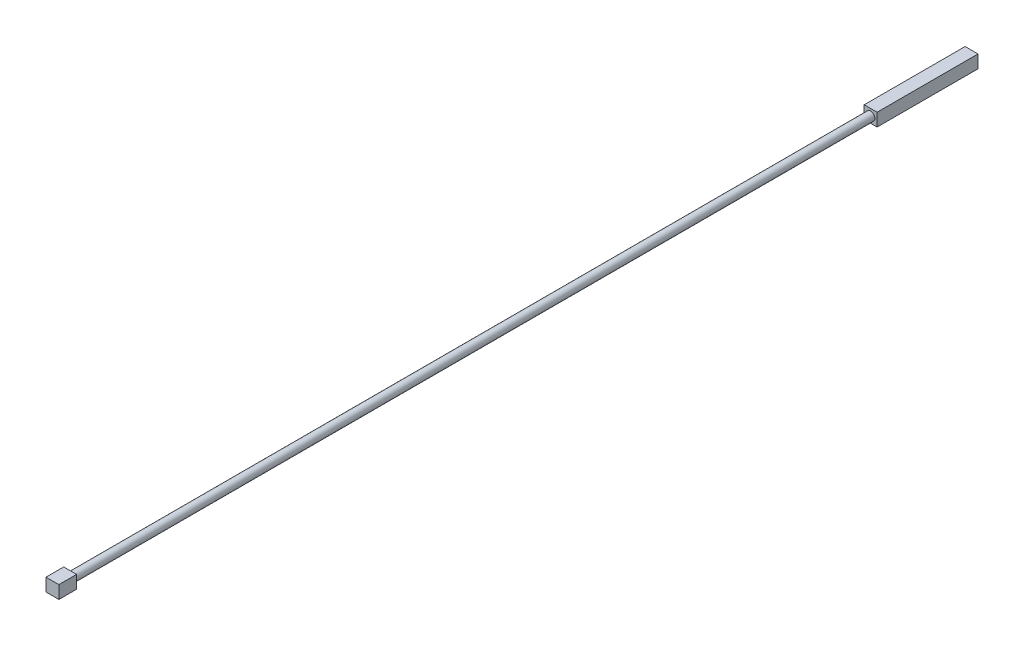
ISO-10303-21;
HEADER;
FILE_DESCRIPTION(('STEP AP214'),'2;1');
FILE_NAME('part.step','',(''),(''),'','','');
FILE_SCHEMA(('AUTOMOTIVE_DESIGN { 1 0 10303 214 1 1 1 1 }'));
ENDSEC;
DATA;
#1=APPLICATION_CONTEXT('core data for automotive mechanical design processes');
#2=APPLICATION_PROTOCOL_DEFINITION('international standard','automotive_design',2000,#1);
#3=PRODUCT_CONTEXT('',#1,'mechanical');
#4=PRODUCT('Part','Part','',(#3));
#5=PRODUCT_RELATED_PRODUCT_CATEGORY('part','',(#4));
#6=PRODUCT_DEFINITION_FORMATION('','',#4);
#7=PRODUCT_DEFINITION_CONTEXT('part definition',#1,'design');
#8=PRODUCT_DEFINITION('design','',#6,#7);
#9=PRODUCT_DEFINITION_SHAPE('','',#8);
#10=(LENGTH_UNIT() NAMED_UNIT(*) SI_UNIT(.MILLI.,.METRE.));
#11=(NAMED_UNIT(*) PLANE_ANGLE_UNIT() SI_UNIT($,.RADIAN.));
#12=(NAMED_UNIT(*) SI_UNIT($,.STERADIAN.) SOLID_ANGLE_UNIT());
#13=UNCERTAINTY_MEASURE_WITH_UNIT(LENGTH_MEASURE(1.E-05),#10,'distance_accuracy_value','');
#14=(GEOMETRIC_REPRESENTATION_CONTEXT(3) GLOBAL_UNCERTAINTY_ASSIGNED_CONTEXT((#13)) GLOBAL_UNIT_ASSIGNED_CONTEXT((#10,
#11,#12)) REPRESENTATION_CONTEXT('',''));
#15=CARTESIAN_POINT('',(0.,0.,0.));
#16=DIRECTION('',(0.,0.,1.));
#17=DIRECTION('',(1.,0.,0.));
#18=AXIS2_PLACEMENT_3D('',#15,#16,#17);
#19=CARTESIAN_POINT('',(0.,0.,1069.975));
#20=DIRECTION('',(0.,0.,-1.));
#21=DIRECTION('',(-1.,0.,0.));
#22=AXIS2_PLACEMENT_3D('',#19,#20,#21);
#23=CYLINDRICAL_SURFACE('',#22,5.);
#24=CARTESIAN_POINT('',(0.,0.,117.475));
#25=DIRECTION('',(0.,0.,-1.));
#26=DIRECTION('',(-1.,0.,0.));
#27=AXIS2_PLACEMENT_3D('',#24,#25,#26);
#28=CIRCLE('',#27,5.);
#29=CARTESIAN_POINT('',(-5.,0.,117.475));
#30=VERTEX_POINT('',#29);
#31=EDGE_CURVE('E48',#30,#30,#28,.T.);
#32=ORIENTED_EDGE('',*,*,#31,.F.);
#33=EDGE_LOOP('',(#32));
#34=FACE_BOUND('',#33,.T.);
#35=CARTESIAN_POINT('',(0.,0.,1049.3375));
#36=DIRECTION('',(0.,0.,1.));
#37=DIRECTION('',(1.,0.,0.));
#38=AXIS2_PLACEMENT_3D('',#35,#36,#37);
#39=CIRCLE('',#38,5.);
#40=CARTESIAN_POINT('',(5.,0.,1049.3375));
#41=VERTEX_POINT('',#40);
#42=EDGE_CURVE('E11',#41,#41,#39,.T.);
#43=ORIENTED_EDGE('',*,*,#42,.F.);
#44=EDGE_LOOP('',(#43));
#45=FACE_BOUND('',#44,.T.);
#46=ADVANCED_FACE('F39',(#34,#45),#23,.T.);
#47=CARTESIAN_POINT('',(-7.5,7.5,117.475));
#48=DIRECTION('',(1.,0.,0.));
#49=DIRECTION('',(0.,1.,0.));
#50=AXIS2_PLACEMENT_3D('',#47,#48,#49);
#51=PLANE('',#50);
#52=DIRECTION('',(0.,-1.,0.));
#53=VECTOR('',#52,1.);
#54=CARTESIAN_POINT('',(-7.5,7.5,0.));
#55=LINE('',#54,#53);
#56=CARTESIAN_POINT('',(-7.5,7.5,0.));
#57=VERTEX_POINT('',#56);
#58=CARTESIAN_POINT('',(-7.5,-7.5,0.));
#59=VERTEX_POINT('',#58);
#60=EDGE_CURVE('E164',#57,#59,#55,.T.);
#61=ORIENTED_EDGE('',*,*,#60,.T.);
#62=DIRECTION('',(0.,0.,-1.));
#63=VECTOR('',#62,1.);
#64=CARTESIAN_POINT('',(-7.5,-7.5,117.475));
#65=LINE('',#64,#63);
#66=CARTESIAN_POINT('',(-7.5,-7.5,117.475));
#67=VERTEX_POINT('',#66);
#68=EDGE_CURVE('E199',#67,#59,#65,.T.);
#69=ORIENTED_EDGE('',*,*,#68,.F.);
#70=DIRECTION('',(0.,-1.,0.));
#71=VECTOR('',#70,1.);
#72=CARTESIAN_POINT('',(-7.5,7.5,117.475));
#73=LINE('',#72,#71);
#74=CARTESIAN_POINT('',(-7.5,7.5,117.475));
#75=VERTEX_POINT('',#74);
#76=EDGE_CURVE('E170',#75,#67,#73,.T.);
#77=ORIENTED_EDGE('',*,*,#76,.F.);
#78=DIRECTION('',(0.,0.,-1.));
#79=VECTOR('',#78,1.);
#80=CARTESIAN_POINT('',(-7.5,7.5,117.475));
#81=LINE('',#80,#79);
#82=EDGE_CURVE('E180',#75,#57,#81,.T.);
#83=ORIENTED_EDGE('',*,*,#82,.T.);
#84=EDGE_LOOP('',(#61,#69,#77,#83));
#85=FACE_BOUND('',#84,.T.);
#86=ADVANCED_FACE('F209',(#85),#51,.F.);
#87=CARTESIAN_POINT('',(7.5,-7.5,117.475));
#88=DIRECTION('',(0.,1.,0.));
#89=DIRECTION('',(-1.,0.,0.));
#90=AXIS2_PLACEMENT_3D('',#87,#88,#89);
#91=PLANE('',#90);
#92=DIRECTION('',(1.,0.,0.));
#93=VECTOR('',#92,1.);
#94=CARTESIAN_POINT('',(7.5,-7.5,0.));
#95=LINE('',#94,#93);
#96=CARTESIAN_POINT('',(7.5,-7.5,0.));
#97=VERTEX_POINT('',#96);
#98=EDGE_CURVE('E184',#59,#97,#95,.T.);
#99=ORIENTED_EDGE('',*,*,#98,.T.);
#100=DIRECTION('',(0.,0.,-1.));
#101=VECTOR('',#100,1.);
#102=CARTESIAN_POINT('',(7.5,-7.5,117.475));
#103=LINE('',#102,#101);
#104=CARTESIAN_POINT('',(7.5,-7.5,117.475));
#105=VERTEX_POINT('',#104);
#106=EDGE_CURVE('E196',#105,#97,#103,.T.);
#107=ORIENTED_EDGE('',*,*,#106,.F.);
#108=DIRECTION('',(1.,0.,0.));
#109=VECTOR('',#108,1.);
#110=CARTESIAN_POINT('',(7.5,-7.5,117.475));
#111=LINE('',#110,#109);
#112=EDGE_CURVE('E88',#67,#105,#111,.T.);
#113=ORIENTED_EDGE('',*,*,#112,.F.);
#114=ORIENTED_EDGE('',*,*,#68,.T.);
#115=EDGE_LOOP('',(#99,#107,#113,#114));
#116=FACE_BOUND('',#115,.T.);
#117=ADVANCED_FACE('F242',(#116),#91,.F.);
#118=CARTESIAN_POINT('',(7.5,7.5,117.475));
#119=DIRECTION('',(-1.,0.,0.));
#120=DIRECTION('',(0.,-1.,0.));
#121=AXIS2_PLACEMENT_3D('',#118,#119,#120);
#122=PLANE('',#121);
#123=DIRECTION('',(0.,1.,0.));
#124=VECTOR('',#123,1.);
#125=CARTESIAN_POINT('',(7.5,7.5,0.));
#126=LINE('',#125,#124);
#127=CARTESIAN_POINT('',(7.5,7.5,0.));
#128=VERTEX_POINT('',#127);
#129=EDGE_CURVE('E74',#97,#128,#126,.T.);
#130=ORIENTED_EDGE('',*,*,#129,.T.);
#131=DIRECTION('',(0.,0.,-1.));
#132=VECTOR('',#131,1.);
#133=CARTESIAN_POINT('',(7.5,7.5,117.475));
#134=LINE('',#133,#132);
#135=CARTESIAN_POINT('',(7.5,7.5,117.475));
#136=VERTEX_POINT('',#135);
#137=EDGE_CURVE('E193',#136,#128,#134,.T.);
#138=ORIENTED_EDGE('',*,*,#137,.F.);
#139=DIRECTION('',(0.,1.,0.));
#140=VECTOR('',#139,1.);
#141=CARTESIAN_POINT('',(7.5,7.5,117.475));
#142=LINE('',#141,#140);
#143=EDGE_CURVE('E175',#105,#136,#142,.T.);
#144=ORIENTED_EDGE('',*,*,#143,.F.);
#145=ORIENTED_EDGE('',*,*,#106,.T.);
#146=EDGE_LOOP('',(#130,#138,#144,#145));
#147=FACE_BOUND('',#146,.T.);
#148=ADVANCED_FACE('F239',(#147),#122,.F.);
#149=CARTESIAN_POINT('',(7.5,7.5,117.475));
#150=DIRECTION('',(0.,-1.,0.));
#151=DIRECTION('',(1.,0.,0.));
#152=AXIS2_PLACEMENT_3D('',#149,#150,#151);
#153=PLANE('',#152);
#154=DIRECTION('',(-1.,0.,0.));
#155=VECTOR('',#154,1.);
#156=CARTESIAN_POINT('',(7.5,7.5,0.));
#157=LINE('',#156,#155);
#158=EDGE_CURVE('E80',#128,#57,#157,.T.);
#159=ORIENTED_EDGE('',*,*,#158,.T.);
#160=ORIENTED_EDGE('',*,*,#82,.F.);
#161=DIRECTION('',(-1.,0.,0.));
#162=VECTOR('',#161,1.);
#163=CARTESIAN_POINT('',(7.5,7.5,117.475));
#164=LINE('',#163,#162);
#165=EDGE_CURVE('E56',#136,#75,#164,.T.);
#166=ORIENTED_EDGE('',*,*,#165,.F.);
#167=ORIENTED_EDGE('',*,*,#137,.T.);
#168=EDGE_LOOP('',(#159,#160,#166,#167));
#169=FACE_BOUND('',#168,.T.);
#170=ADVANCED_FACE('F236',(#169),#153,.F.);
#171=CARTESIAN_POINT('',(0.,0.,117.475));
#172=DIRECTION('',(0.,0.,-1.));
#173=DIRECTION('',(-1.,0.,0.));
#174=AXIS2_PLACEMENT_3D('',#171,#172,#173);
#175=PLANE('',#174);
#176=ORIENTED_EDGE('',*,*,#31,.T.);
#177=EDGE_LOOP('',(#176));
#178=FACE_BOUND('',#177,.T.);
#179=ORIENTED_EDGE('',*,*,#76,.T.);
#180=ORIENTED_EDGE('',*,*,#112,.T.);
#181=ORIENTED_EDGE('',*,*,#143,.T.);
#182=ORIENTED_EDGE('',*,*,#165,.T.);
#183=EDGE_LOOP('',(#179,#180,#181,#182));
#184=FACE_BOUND('',#183,.T.);
#185=ADVANCED_FACE('F205',(#178,#184),#175,.F.);
#186=CARTESIAN_POINT('',(0.,0.,0.));
#187=DIRECTION('',(0.,0.,1.));
#188=DIRECTION('',(1.,0.,0.));
#189=AXIS2_PLACEMENT_3D('',#186,#187,#188);
#190=PLANE('',#189);
#191=ORIENTED_EDGE('',*,*,#60,.F.);
#192=ORIENTED_EDGE('',*,*,#158,.F.);
#193=ORIENTED_EDGE('',*,*,#129,.F.);
#194=ORIENTED_EDGE('',*,*,#98,.F.);
#195=EDGE_LOOP('',(#191,#192,#193,#194));
#196=FACE_BOUND('',#195,.T.);
#197=ADVANCED_FACE('F233',(#196),#190,.F.);
#198=CARTESIAN_POINT('',(7.5,7.5,1049.3375));
#199=DIRECTION('',(0.,1.,0.));
#200=DIRECTION('',(-1.,0.,0.));
#201=AXIS2_PLACEMENT_3D('',#198,#199,#200);
#202=PLANE('',#201);
#203=DIRECTION('',(-1.,0.,0.));
#204=VECTOR('',#203,1.);
#205=CARTESIAN_POINT('',(7.5,7.5,1069.975));
#206=LINE('',#205,#204);
#207=CARTESIAN_POINT('',(7.5,7.5,1069.975));
#208=VERTEX_POINT('',#207);
#209=CARTESIAN_POINT('',(-7.5,7.5,1069.975));
#210=VERTEX_POINT('',#209);
#211=EDGE_CURVE('E154',#208,#210,#206,.T.);
#212=ORIENTED_EDGE('',*,*,#211,.F.);
#213=DIRECTION('',(0.,0.,1.));
#214=VECTOR('',#213,1.);
#215=CARTESIAN_POINT('',(7.5,7.5,1049.3375));
#216=LINE('',#215,#214);
#217=CARTESIAN_POINT('',(7.5,7.5,1049.3375));
#218=VERTEX_POINT('',#217);
#219=EDGE_CURVE('E141',#218,#208,#216,.T.);
#220=ORIENTED_EDGE('',*,*,#219,.F.);
#221=DIRECTION('',(-1.,0.,0.));
#222=VECTOR('',#221,1.);
#223=CARTESIAN_POINT('',(7.5,7.5,1049.3375));
#224=LINE('',#223,#222);
#225=CARTESIAN_POINT('',(-7.5,7.5,1049.3375));
#226=VERTEX_POINT('',#225);
#227=EDGE_CURVE('E134',#218,#226,#224,.T.);
#228=ORIENTED_EDGE('',*,*,#227,.T.);
#229=DIRECTION('',(0.,0.,1.));
#230=VECTOR('',#229,1.);
#231=CARTESIAN_POINT('',(-7.5,7.5,1049.3375));
#232=LINE('',#231,#230);
#233=EDGE_CURVE('E115',#226,#210,#232,.T.);
#234=ORIENTED_EDGE('',*,*,#233,.T.);
#235=EDGE_LOOP('',(#212,#220,#228,#234));
#236=FACE_BOUND('',#235,.T.);
#237=ADVANCED_FACE('F140',(#236),#202,.T.);
#238=CARTESIAN_POINT('',(7.5,-7.5,1049.3375));
#239=DIRECTION('',(1.,0.,0.));
#240=DIRECTION('',(0.,1.,0.));
#241=AXIS2_PLACEMENT_3D('',#238,#239,#240);
#242=PLANE('',#241);
#243=DIRECTION('',(0.,1.,0.));
#244=VECTOR('',#243,1.);
#245=CARTESIAN_POINT('',(7.5,-7.5,1069.975));
#246=LINE('',#245,#244);
#247=CARTESIAN_POINT('',(7.5,-7.5,1069.975));
#248=VERTEX_POINT('',#247);
#249=EDGE_CURVE('E143',#248,#208,#246,.T.);
#250=ORIENTED_EDGE('',*,*,#249,.F.);
#251=DIRECTION('',(0.,0.,1.));
#252=VECTOR('',#251,1.);
#253=CARTESIAN_POINT('',(7.5,-7.5,1049.3375));
#254=LINE('',#253,#252);
#255=CARTESIAN_POINT('',(7.5,-7.5,1049.3375));
#256=VERTEX_POINT('',#255);
#257=EDGE_CURVE('E165',#256,#248,#254,.T.);
#258=ORIENTED_EDGE('',*,*,#257,.F.);
#259=DIRECTION('',(0.,1.,0.));
#260=VECTOR('',#259,1.);
#261=CARTESIAN_POINT('',(7.5,-7.5,1049.3375));
#262=LINE('',#261,#260);
#263=EDGE_CURVE('E127',#256,#218,#262,.T.);
#264=ORIENTED_EDGE('',*,*,#263,.T.);
#265=ORIENTED_EDGE('',*,*,#219,.T.);
#266=EDGE_LOOP('',(#250,#258,#264,#265));
#267=FACE_BOUND('',#266,.T.);
#268=ADVANCED_FACE('F224',(#267),#242,.T.);
#269=CARTESIAN_POINT('',(-7.5,-7.5,1049.3375));
#270=DIRECTION('',(0.,-1.,0.));
#271=DIRECTION('',(1.,0.,0.));
#272=AXIS2_PLACEMENT_3D('',#269,#270,#271);
#273=PLANE('',#272);
#274=DIRECTION('',(1.,0.,0.));
#275=VECTOR('',#274,1.);
#276=CARTESIAN_POINT('',(-7.5,-7.5,1069.975));
#277=LINE('',#276,#275);
#278=CARTESIAN_POINT('',(-7.5,-7.5,1069.975));
#279=VERTEX_POINT('',#278);
#280=EDGE_CURVE('E147',#279,#248,#277,.T.);
#281=ORIENTED_EDGE('',*,*,#280,.F.);
#282=DIRECTION('',(0.,0.,1.));
#283=VECTOR('',#282,1.);
#284=CARTESIAN_POINT('',(-7.5,-7.5,1049.3375));
#285=LINE('',#284,#283);
#286=CARTESIAN_POINT('',(-7.5,-7.5,1049.3375));
#287=VERTEX_POINT('',#286);
#288=EDGE_CURVE('E126',#287,#279,#285,.T.);
#289=ORIENTED_EDGE('',*,*,#288,.F.);
#290=DIRECTION('',(1.,0.,0.));
#291=VECTOR('',#290,1.);
#292=CARTESIAN_POINT('',(-7.5,-7.5,1049.3375));
#293=LINE('',#292,#291);
#294=EDGE_CURVE('E137',#287,#256,#293,.T.);
#295=ORIENTED_EDGE('',*,*,#294,.T.);
#296=ORIENTED_EDGE('',*,*,#257,.T.);
#297=EDGE_LOOP('',(#281,#289,#295,#296));
#298=FACE_BOUND('',#297,.T.);
#299=ADVANCED_FACE('F221',(#298),#273,.T.);
#300=CARTESIAN_POINT('',(-7.5,7.5,1049.3375));
#301=DIRECTION('',(-1.,0.,0.));
#302=DIRECTION('',(0.,-1.,0.));
#303=AXIS2_PLACEMENT_3D('',#300,#301,#302);
#304=PLANE('',#303);
#305=DIRECTION('',(0.,-1.,0.));
#306=VECTOR('',#305,1.);
#307=CARTESIAN_POINT('',(-7.5,7.5,1069.975));
#308=LINE('',#307,#306);
#309=EDGE_CURVE('E120',#210,#279,#308,.T.);
#310=ORIENTED_EDGE('',*,*,#309,.F.);
#311=ORIENTED_EDGE('',*,*,#233,.F.);
#312=DIRECTION('',(0.,-1.,0.));
#313=VECTOR('',#312,1.);
#314=CARTESIAN_POINT('',(-7.5,7.5,1049.3375));
#315=LINE('',#314,#313);
#316=EDGE_CURVE('E118',#226,#287,#315,.T.);
#317=ORIENTED_EDGE('',*,*,#316,.T.);
#318=ORIENTED_EDGE('',*,*,#288,.T.);
#319=EDGE_LOOP('',(#310,#311,#317,#318));
#320=FACE_BOUND('',#319,.T.);
#321=ADVANCED_FACE('F117',(#320),#304,.T.);
#322=CARTESIAN_POINT('',(0.,0.,1049.3375));
#323=DIRECTION('',(0.,0.,1.));
#324=DIRECTION('',(1.,0.,0.));
#325=AXIS2_PLACEMENT_3D('',#322,#323,#324);
#326=PLANE('',#325);
#327=ORIENTED_EDGE('',*,*,#42,.T.);
#328=EDGE_LOOP('',(#327));
#329=FACE_BOUND('',#328,.T.);
#330=ORIENTED_EDGE('',*,*,#227,.F.);
#331=ORIENTED_EDGE('',*,*,#263,.F.);
#332=ORIENTED_EDGE('',*,*,#294,.F.);
#333=ORIENTED_EDGE('',*,*,#316,.F.);
#334=EDGE_LOOP('',(#330,#331,#332,#333));
#335=FACE_BOUND('',#334,.T.);
#336=ADVANCED_FACE('F132',(#329,#335),#326,.F.);
#337=CARTESIAN_POINT('',(0.,0.,1069.975));
#338=DIRECTION('',(0.,0.,1.));
#339=DIRECTION('',(1.,0.,0.));
#340=AXIS2_PLACEMENT_3D('',#337,#338,#339);
#341=PLANE('',#340);
#342=ORIENTED_EDGE('',*,*,#211,.T.);
#343=ORIENTED_EDGE('',*,*,#309,.T.);
#344=ORIENTED_EDGE('',*,*,#280,.T.);
#345=ORIENTED_EDGE('',*,*,#249,.T.);
#346=EDGE_LOOP('',(#342,#343,#344,#345));
#347=FACE_BOUND('',#346,.T.);
#348=ADVANCED_FACE('F213',(#347),#341,.T.);
#349=CLOSED_SHELL('',(#46,#86,#117,#148,#170,#185,#197,#237,#268,#299,#321,#336,#348));
#350=MANIFOLD_SOLID_BREP('B2',#349);
#351=ADVANCED_BREP_SHAPE_REPRESENTATION('',(#18,#350),#14);
#352=SHAPE_DEFINITION_REPRESENTATION(#9,#351);
ENDSEC;
END-ISO-10303-21;
